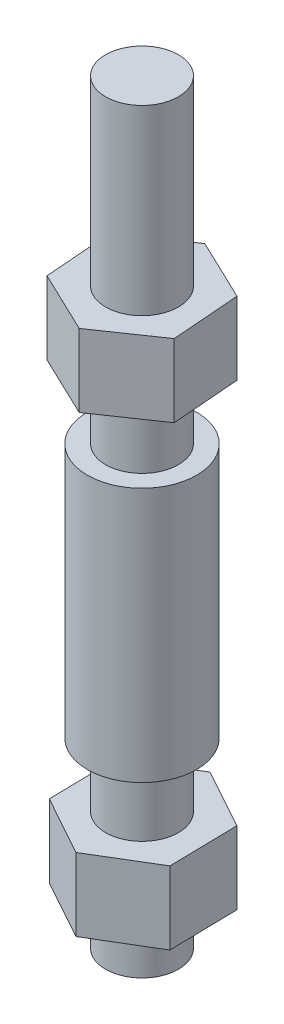
ISO-10303-21;
HEADER;
FILE_DESCRIPTION(('STEP AP214'),'2;1');
FILE_NAME('part.step','',(''),(''),'','','');
FILE_SCHEMA(('AUTOMOTIVE_DESIGN { 1 0 10303 214 1 1 1 1 }'));
ENDSEC;
DATA;
#1=APPLICATION_CONTEXT('core data for automotive mechanical design processes');
#2=APPLICATION_PROTOCOL_DEFINITION('international standard','automotive_design',2000,#1);
#3=PRODUCT_CONTEXT('',#1,'mechanical');
#4=PRODUCT('Part','Part','',(#3));
#5=PRODUCT_RELATED_PRODUCT_CATEGORY('part','',(#4));
#6=PRODUCT_DEFINITION_FORMATION('','',#4);
#7=PRODUCT_DEFINITION_CONTEXT('part definition',#1,'design');
#8=PRODUCT_DEFINITION('design','',#6,#7);
#9=PRODUCT_DEFINITION_SHAPE('','',#8);
#10=(LENGTH_UNIT() NAMED_UNIT(*) SI_UNIT(.MILLI.,.METRE.));
#11=(NAMED_UNIT(*) PLANE_ANGLE_UNIT() SI_UNIT($,.RADIAN.));
#12=(NAMED_UNIT(*) SI_UNIT($,.STERADIAN.) SOLID_ANGLE_UNIT());
#13=UNCERTAINTY_MEASURE_WITH_UNIT(LENGTH_MEASURE(1.E-05),#10,'distance_accuracy_value','');
#14=(GEOMETRIC_REPRESENTATION_CONTEXT(3) GLOBAL_UNCERTAINTY_ASSIGNED_CONTEXT((#13)) GLOBAL_UNIT_ASSIGNED_CONTEXT((#10,
#11,#12)) REPRESENTATION_CONTEXT('',''));
#15=CARTESIAN_POINT('',(0.,0.,0.));
#16=DIRECTION('',(0.,0.,1.));
#17=DIRECTION('',(1.,0.,0.));
#18=AXIS2_PLACEMENT_3D('',#15,#16,#17);
#19=CARTESIAN_POINT('',(0.,83.,0.));
#20=DIRECTION('',(0.,-1.,0.));
#21=DIRECTION('',(0.,0.,-1.));
#22=AXIS2_PLACEMENT_3D('',#19,#20,#21);
#23=CYLINDRICAL_SURFACE('',#22,4.);
#24=CARTESIAN_POINT('',(0.,48.,0.));
#25=DIRECTION('',(0.,1.,0.));
#26=DIRECTION('',(0.,0.,1.));
#27=AXIS2_PLACEMENT_3D('',#24,#25,#26);
#28=CIRCLE('',#27,4.);
#29=CARTESIAN_POINT('',(0.,48.,4.));
#30=VERTEX_POINT('',#29);
#31=EDGE_CURVE('E153',#30,#30,#28,.T.);
#32=ORIENTED_EDGE('',*,*,#31,.T.);
#33=EDGE_LOOP('',(#32));
#34=FACE_BOUND('',#33,.T.);
#35=CARTESIAN_POINT('',(0.,55.,0.));
#36=DIRECTION('',(0.,1.,0.));
#37=DIRECTION('',(0.,0.,1.));
#38=AXIS2_PLACEMENT_3D('',#35,#36,#37);
#39=CIRCLE('',#38,4.);
#40=CARTESIAN_POINT('',(0.,55.,4.));
#41=VERTEX_POINT('',#40);
#42=EDGE_CURVE('E11',#41,#41,#39,.T.);
#43=ORIENTED_EDGE('',*,*,#42,.F.);
#44=EDGE_LOOP('',(#43));
#45=FACE_BOUND('',#44,.T.);
#46=ADVANCED_FACE('F33',(#34,#45),#23,.T.);
#47=CARTESIAN_POINT('',(0.,20.,0.));
#48=DIRECTION('',(0.,-1.,0.));
#49=DIRECTION('',(0.,0.,-1.));
#50=AXIS2_PLACEMENT_3D('',#47,#48,#49);
#51=CYLINDRICAL_SURFACE('',#50,4.);
#52=CARTESIAN_POINT('',(0.,20.,0.));
#53=DIRECTION('',(0.,1.,0.));
#54=DIRECTION('',(0.,0.,1.));
#55=AXIS2_PLACEMENT_3D('',#52,#53,#54);
#56=CIRCLE('',#55,4.);
#57=CARTESIAN_POINT('',(0.,20.,4.));
#58=VERTEX_POINT('',#57);
#59=EDGE_CURVE('E156',#58,#58,#56,.T.);
#60=ORIENTED_EDGE('',*,*,#59,.F.);
#61=EDGE_LOOP('',(#60));
#62=FACE_BOUND('',#61,.T.);
#63=CARTESIAN_POINT('',(0.,13.,0.));
#64=DIRECTION('',(0.,-1.,0.));
#65=DIRECTION('',(0.,0.,-1.));
#66=AXIS2_PLACEMENT_3D('',#63,#64,#65);
#67=CIRCLE('',#66,4.);
#68=CARTESIAN_POINT('',(0.,13.,-4.));
#69=VERTEX_POINT('',#68);
#70=EDGE_CURVE('E42',#69,#69,#67,.T.);
#71=ORIENTED_EDGE('',*,*,#70,.F.);
#72=EDGE_LOOP('',(#71));
#73=FACE_BOUND('',#72,.T.);
#74=ADVANCED_FACE('F218',(#62,#73),#51,.T.);
#75=CARTESIAN_POINT('',(0.,48.,0.));
#76=DIRECTION('',(0.,-1.,0.));
#77=DIRECTION('',(0.,0.,-1.));
#78=AXIS2_PLACEMENT_3D('',#75,#76,#77);
#79=CYLINDRICAL_SURFACE('',#78,6.);
#80=CARTESIAN_POINT('',(0.,48.,0.));
#81=DIRECTION('',(0.,1.,0.));
#82=DIRECTION('',(0.,0.,1.));
#83=AXIS2_PLACEMENT_3D('',#80,#81,#82);
#84=CIRCLE('',#83,6.);
#85=CARTESIAN_POINT('',(0.,48.,6.));
#86=VERTEX_POINT('',#85);
#87=EDGE_CURVE('E157',#86,#86,#84,.T.);
#88=ORIENTED_EDGE('',*,*,#87,.F.);
#89=EDGE_LOOP('',(#88));
#90=FACE_BOUND('',#89,.T.);
#91=CARTESIAN_POINT('',(0.,20.,0.));
#92=DIRECTION('',(0.,1.,0.));
#93=DIRECTION('',(0.,0.,1.));
#94=AXIS2_PLACEMENT_3D('',#91,#92,#93);
#95=CIRCLE('',#94,6.);
#96=CARTESIAN_POINT('',(0.,20.,6.));
#97=VERTEX_POINT('',#96);
#98=EDGE_CURVE('E152',#97,#97,#95,.T.);
#99=ORIENTED_EDGE('',*,*,#98,.T.);
#100=EDGE_LOOP('',(#99));
#101=FACE_BOUND('',#100,.T.);
#102=ADVANCED_FACE('F225',(#90,#101),#79,.T.);
#103=CARTESIAN_POINT('',(0.,48.,0.));
#104=DIRECTION('',(0.,1.,0.));
#105=DIRECTION('',(0.,0.,1.));
#106=AXIS2_PLACEMENT_3D('',#103,#104,#105);
#107=PLANE('',#106);
#108=ORIENTED_EDGE('',*,*,#31,.F.);
#109=EDGE_LOOP('',(#108));
#110=FACE_BOUND('',#109,.T.);
#111=ORIENTED_EDGE('',*,*,#87,.T.);
#112=EDGE_LOOP('',(#111));
#113=FACE_BOUND('',#112,.T.);
#114=ADVANCED_FACE('F418',(#110,#113),#107,.T.);
#115=CARTESIAN_POINT('',(0.,20.,0.));
#116=DIRECTION('',(0.,1.,0.));
#117=DIRECTION('',(0.,0.,1.));
#118=AXIS2_PLACEMENT_3D('',#115,#116,#117);
#119=PLANE('',#118);
#120=ORIENTED_EDGE('',*,*,#59,.T.);
#121=EDGE_LOOP('',(#120));
#122=FACE_BOUND('',#121,.T.);
#123=ORIENTED_EDGE('',*,*,#98,.F.);
#124=EDGE_LOOP('',(#123));
#125=FACE_BOUND('',#124,.T.);
#126=ADVANCED_FACE('F214',(#122,#125),#119,.F.);
#127=CARTESIAN_POINT('',(0.260009596375043,13.,7.50427051243021));
#128=DIRECTION('',(-0.483902484389894,0.,0.875121926134461));
#129=DIRECTION('',(0.875121926134461,0.,0.483902484389894));
#130=AXIS2_PLACEMENT_3D('',#127,#128,#129);
#131=PLANE('',#130);
#132=DIRECTION('',(-0.875121926134461,0.,-0.483902484389894));
#133=VECTOR('',#132,1.);
#134=CARTESIAN_POINT('',(0.260009596375043,5.,7.50427051243021));
#135=LINE('',#134,#133);
#136=CARTESIAN_POINT('',(0.260009596375043,5.,7.50427051243021));
#137=VERTEX_POINT('',#136);
#138=CARTESIAN_POINT('',(-6.30826483878213,5.,3.87231452731777));
#139=VERTEX_POINT('',#138);
#140=EDGE_CURVE('E125',#137,#139,#135,.T.);
#141=ORIENTED_EDGE('',*,*,#140,.F.);
#142=DIRECTION('',(0.,-1.,0.));
#143=VECTOR('',#142,1.);
#144=CARTESIAN_POINT('',(0.260009596375043,13.,7.50427051243021));
#145=LINE('',#144,#143);
#146=CARTESIAN_POINT('',(0.260009596375043,13.,7.50427051243021));
#147=VERTEX_POINT('',#146);
#148=EDGE_CURVE('E50',#147,#137,#145,.T.);
#149=ORIENTED_EDGE('',*,*,#148,.F.);
#150=DIRECTION('',(-0.875121926134461,0.,-0.483902484389894));
#151=VECTOR('',#150,1.);
#152=CARTESIAN_POINT('',(0.260009596375043,13.,7.50427051243021));
#153=LINE('',#152,#151);
#154=CARTESIAN_POINT('',(-6.30826483878213,13.,3.87231452731777));
#155=VERTEX_POINT('',#154);
#156=EDGE_CURVE('E141',#147,#155,#153,.T.);
#157=ORIENTED_EDGE('',*,*,#156,.T.);
#158=DIRECTION('',(0.,-1.,0.));
#159=VECTOR('',#158,1.);
#160=CARTESIAN_POINT('',(-6.30826483878213,13.,3.87231452731777));
#161=LINE('',#160,#159);
#162=EDGE_CURVE('E86',#155,#139,#161,.T.);
#163=ORIENTED_EDGE('',*,*,#162,.T.);
#164=EDGE_LOOP('',(#141,#149,#157,#163));
#165=FACE_BOUND('',#164,.T.);
#166=ADVANCED_FACE('F203',(#165),#131,.T.);
#167=CARTESIAN_POINT('',(6.68951296248794,13.,3.63195598511244));
#168=DIRECTION('',(0.515926577246265,0.,0.856632807503281));
#169=DIRECTION('',(0.856632807503281,0.,-0.515926577246265));
#170=AXIS2_PLACEMENT_3D('',#167,#168,#169);
#171=PLANE('',#170);
#172=DIRECTION('',(-0.856632807503281,0.,0.515926577246265));
#173=VECTOR('',#172,1.);
#174=CARTESIAN_POINT('',(6.68951296248794,5.,3.63195598511244));
#175=LINE('',#174,#173);
#176=CARTESIAN_POINT('',(6.68951296248794,5.,3.63195598511244));
#177=VERTEX_POINT('',#176);
#178=EDGE_CURVE('E138',#177,#137,#175,.T.);
#179=ORIENTED_EDGE('',*,*,#178,.F.);
#180=DIRECTION('',(0.,-1.,0.));
#181=VECTOR('',#180,1.);
#182=CARTESIAN_POINT('',(6.68951296248794,13.,3.63195598511244));
#183=LINE('',#182,#181);
#184=CARTESIAN_POINT('',(6.68951296248794,13.,3.63195598511244));
#185=VERTEX_POINT('',#184);
#186=EDGE_CURVE('E74',#185,#177,#183,.T.);
#187=ORIENTED_EDGE('',*,*,#186,.F.);
#188=DIRECTION('',(-0.856632807503281,0.,0.515926577246265));
#189=VECTOR('',#188,1.);
#190=CARTESIAN_POINT('',(6.68951296248794,13.,3.63195598511244));
#191=LINE('',#190,#189);
#192=EDGE_CURVE('E115',#185,#147,#191,.T.);
#193=ORIENTED_EDGE('',*,*,#192,.T.);
#194=ORIENTED_EDGE('',*,*,#148,.T.);
#195=EDGE_LOOP('',(#179,#187,#193,#194));
#196=FACE_BOUND('',#195,.T.);
#197=ADVANCED_FACE('F206',(#196),#171,.T.);
#198=CARTESIAN_POINT('',(6.55074189344367,13.,-3.87231452731777));
#199=DIRECTION('',(0.999829061636159,0.,-0.0184891186311792));
#200=DIRECTION('',(-0.0184891186311792,0.,-0.999829061636159));
#201=AXIS2_PLACEMENT_3D('',#198,#199,#200);
#202=PLANE('',#201);
#203=DIRECTION('',(0.0184891186311792,0.,0.999829061636159));
#204=VECTOR('',#203,1.);
#205=CARTESIAN_POINT('',(6.55074189344367,5.,-3.87231452731777));
#206=LINE('',#205,#204);
#207=CARTESIAN_POINT('',(6.55074189344367,5.,-3.87231452731777));
#208=VERTEX_POINT('',#207);
#209=EDGE_CURVE('E102',#208,#177,#206,.T.);
#210=ORIENTED_EDGE('',*,*,#209,.F.);
#211=DIRECTION('',(0.,-1.,0.));
#212=VECTOR('',#211,1.);
#213=CARTESIAN_POINT('',(6.55074189344367,13.,-3.87231452731777));
#214=LINE('',#213,#212);
#215=CARTESIAN_POINT('',(6.55074189344367,13.,-3.87231452731777));
#216=VERTEX_POINT('',#215);
#217=EDGE_CURVE('E97',#216,#208,#214,.T.);
#218=ORIENTED_EDGE('',*,*,#217,.F.);
#219=DIRECTION('',(0.0184891186311792,0.,0.999829061636159));
#220=VECTOR('',#219,1.);
#221=CARTESIAN_POINT('',(6.55074189344367,13.,-3.87231452731777));
#222=LINE('',#221,#220);
#223=EDGE_CURVE('E100',#216,#185,#222,.T.);
#224=ORIENTED_EDGE('',*,*,#223,.T.);
#225=ORIENTED_EDGE('',*,*,#186,.T.);
#226=EDGE_LOOP('',(#210,#218,#224,#225));
#227=FACE_BOUND('',#226,.T.);
#228=ADVANCED_FACE('F99',(#227),#202,.T.);
#229=CARTESIAN_POINT('',(-0.0175325417135008,13.,-7.50427051243021));
#230=DIRECTION('',(0.483902484389894,0.,-0.87512192613446));
#231=DIRECTION('',(-0.875121926134461,0.,-0.483902484389894));
#232=AXIS2_PLACEMENT_3D('',#229,#230,#231);
#233=PLANE('',#232);
#234=DIRECTION('',(0.87512192613446,0.,0.483902484389894));
#235=VECTOR('',#234,1.);
#236=CARTESIAN_POINT('',(-0.0175325417135008,5.,-7.50427051243021));
#237=LINE('',#236,#235);
#238=CARTESIAN_POINT('',(-0.0175325417135008,5.,-7.50427051243021));
#239=VERTEX_POINT('',#238);
#240=EDGE_CURVE('E135',#239,#208,#237,.T.);
#241=ORIENTED_EDGE('',*,*,#240,.F.);
#242=DIRECTION('',(0.,-1.,0.));
#243=VECTOR('',#242,1.);
#244=CARTESIAN_POINT('',(-0.0175325417135008,13.,-7.50427051243021));
#245=LINE('',#244,#243);
#246=CARTESIAN_POINT('',(-0.0175325417135008,13.,-7.50427051243021));
#247=VERTEX_POINT('',#246);
#248=EDGE_CURVE('E107',#247,#239,#245,.T.);
#249=ORIENTED_EDGE('',*,*,#248,.F.);
#250=DIRECTION('',(0.87512192613446,0.,0.483902484389894));
#251=VECTOR('',#250,1.);
#252=CARTESIAN_POINT('',(-0.0175325417135008,13.,-7.50427051243021));
#253=LINE('',#252,#251);
#254=EDGE_CURVE('E113',#247,#216,#253,.T.);
#255=ORIENTED_EDGE('',*,*,#254,.T.);
#256=ORIENTED_EDGE('',*,*,#217,.T.);
#257=EDGE_LOOP('',(#241,#249,#255,#256));
#258=FACE_BOUND('',#257,.T.);
#259=ADVANCED_FACE('F117',(#258),#233,.T.);
#260=CARTESIAN_POINT('',(-6.4470359078264,13.,-3.63195598511244));
#261=DIRECTION('',(-0.515926577246265,0.,-0.856632807503281));
#262=DIRECTION('',(-0.856632807503281,0.,0.515926577246265));
#263=AXIS2_PLACEMENT_3D('',#260,#261,#262);
#264=PLANE('',#263);
#265=DIRECTION('',(0.856632807503281,0.,-0.515926577246265));
#266=VECTOR('',#265,1.);
#267=CARTESIAN_POINT('',(-6.4470359078264,5.,-3.63195598511244));
#268=LINE('',#267,#266);
#269=CARTESIAN_POINT('',(-6.4470359078264,5.,-3.63195598511244));
#270=VERTEX_POINT('',#269);
#271=EDGE_CURVE('E132',#270,#239,#268,.T.);
#272=ORIENTED_EDGE('',*,*,#271,.F.);
#273=DIRECTION('',(0.,-1.,0.));
#274=VECTOR('',#273,1.);
#275=CARTESIAN_POINT('',(-6.4470359078264,13.,-3.63195598511244));
#276=LINE('',#275,#274);
#277=CARTESIAN_POINT('',(-6.4470359078264,13.,-3.63195598511244));
#278=VERTEX_POINT('',#277);
#279=EDGE_CURVE('E146',#278,#270,#276,.T.);
#280=ORIENTED_EDGE('',*,*,#279,.F.);
#281=DIRECTION('',(0.856632807503281,0.,-0.515926577246265));
#282=VECTOR('',#281,1.);
#283=CARTESIAN_POINT('',(-6.4470359078264,13.,-3.63195598511244));
#284=LINE('',#283,#282);
#285=EDGE_CURVE('E118',#278,#247,#284,.T.);
#286=ORIENTED_EDGE('',*,*,#285,.T.);
#287=ORIENTED_EDGE('',*,*,#248,.T.);
#288=EDGE_LOOP('',(#272,#280,#286,#287));
#289=FACE_BOUND('',#288,.T.);
#290=ADVANCED_FACE('F248',(#289),#264,.T.);
#291=CARTESIAN_POINT('',(-6.30826483878213,13.,3.87231452731777));
#292=DIRECTION('',(-0.999829061636159,0.,0.0184891186311789));
#293=DIRECTION('',(0.0184891186311789,0.,0.999829061636159));
#294=AXIS2_PLACEMENT_3D('',#291,#292,#293);
#295=PLANE('',#294);
#296=DIRECTION('',(-0.0184891186311789,0.,-0.999829061636159));
#297=VECTOR('',#296,1.);
#298=CARTESIAN_POINT('',(-6.30826483878213,5.,3.87231452731777));
#299=LINE('',#298,#297);
#300=EDGE_CURVE('E128',#139,#270,#299,.T.);
#301=ORIENTED_EDGE('',*,*,#300,.F.);
#302=ORIENTED_EDGE('',*,*,#162,.F.);
#303=DIRECTION('',(-0.0184891186311789,0.,-0.999829061636159));
#304=VECTOR('',#303,1.);
#305=CARTESIAN_POINT('',(-6.30826483878213,13.,3.87231452731777));
#306=LINE('',#305,#304);
#307=EDGE_CURVE('E120',#155,#278,#306,.T.);
#308=ORIENTED_EDGE('',*,*,#307,.T.);
#309=ORIENTED_EDGE('',*,*,#279,.T.);
#310=EDGE_LOOP('',(#301,#302,#308,#309));
#311=FACE_BOUND('',#310,.T.);
#312=ADVANCED_FACE('F201',(#311),#295,.T.);
#313=CARTESIAN_POINT('',(0.,13.,0.));
#314=DIRECTION('',(0.,-1.,0.));
#315=DIRECTION('',(0.,0.,-1.));
#316=AXIS2_PLACEMENT_3D('',#313,#314,#315);
#317=PLANE('',#316);
#318=ORIENTED_EDGE('',*,*,#70,.T.);
#319=EDGE_LOOP('',(#318));
#320=FACE_BOUND('',#319,.T.);
#321=ORIENTED_EDGE('',*,*,#156,.F.);
#322=ORIENTED_EDGE('',*,*,#192,.F.);
#323=ORIENTED_EDGE('',*,*,#223,.F.);
#324=ORIENTED_EDGE('',*,*,#254,.F.);
#325=ORIENTED_EDGE('',*,*,#285,.F.);
#326=ORIENTED_EDGE('',*,*,#307,.F.);
#327=EDGE_LOOP('',(#321,#322,#323,#324,#325,#326));
#328=FACE_BOUND('',#327,.T.);
#329=ADVANCED_FACE('F111',(#320,#328),#317,.F.);
#330=CARTESIAN_POINT('',(0.,5.,0.));
#331=DIRECTION('',(0.,-1.,0.));
#332=DIRECTION('',(0.,0.,-1.));
#333=AXIS2_PLACEMENT_3D('',#330,#331,#332);
#334=PLANE('',#333);
#335=CARTESIAN_POINT('',(0.,5.,0.));
#336=DIRECTION('',(0.,-1.,0.));
#337=DIRECTION('',(0.,0.,-1.));
#338=AXIS2_PLACEMENT_3D('',#335,#336,#337);
#339=CIRCLE('',#338,4.);
#340=CARTESIAN_POINT('',(0.,5.,-4.));
#341=VERTEX_POINT('',#340);
#342=EDGE_CURVE('E143',#341,#341,#339,.T.);
#343=ORIENTED_EDGE('',*,*,#342,.F.);
#344=EDGE_LOOP('',(#343));
#345=FACE_BOUND('',#344,.T.);
#346=ORIENTED_EDGE('',*,*,#140,.T.);
#347=ORIENTED_EDGE('',*,*,#300,.T.);
#348=ORIENTED_EDGE('',*,*,#271,.T.);
#349=ORIENTED_EDGE('',*,*,#240,.T.);
#350=ORIENTED_EDGE('',*,*,#209,.T.);
#351=ORIENTED_EDGE('',*,*,#178,.T.);
#352=EDGE_LOOP('',(#346,#347,#348,#349,#350,#351));
#353=FACE_BOUND('',#352,.T.);
#354=ADVANCED_FACE('F205',(#345,#353),#334,.T.);
#355=CARTESIAN_POINT('',(0.,0.,0.));
#356=DIRECTION('',(0.,1.,0.));
#357=DIRECTION('',(0.,0.,1.));
#358=AXIS2_PLACEMENT_3D('',#355,#356,#357);
#359=PLANE('',#358);
#360=CARTESIAN_POINT('',(0.,0.,0.));
#361=DIRECTION('',(0.,1.,0.));
#362=DIRECTION('',(0.,0.,1.));
#363=AXIS2_PLACEMENT_3D('',#360,#361,#362);
#364=CIRCLE('',#363,4.);
#365=CARTESIAN_POINT('',(0.,0.,4.));
#366=VERTEX_POINT('',#365);
#367=EDGE_CURVE('E160',#366,#366,#364,.T.);
#368=ORIENTED_EDGE('',*,*,#367,.F.);
#369=EDGE_LOOP('',(#368));
#370=FACE_BOUND('',#369,.T.);
#371=ADVANCED_FACE('F278',(#370),#359,.F.);
#372=ORIENTED_EDGE('',*,*,#342,.T.);
#373=EDGE_LOOP('',(#372));
#374=FACE_BOUND('',#373,.T.);
#375=ORIENTED_EDGE('',*,*,#367,.T.);
#376=EDGE_LOOP('',(#375));
#377=FACE_BOUND('',#376,.T.);
#378=ADVANCED_FACE('F35',(#374,#377),#51,.T.);
#379=CARTESIAN_POINT('',(0.586534649413178,55.,7.48260051308174));
#380=DIRECTION('',(0.566148008063003,0.,0.824303604848538));
#381=DIRECTION('',(0.824303604848538,0.,-0.566148008063003));
#382=AXIS2_PLACEMENT_3D('',#379,#380,#381);
#383=PLANE('',#382);
#384=DIRECTION('',(0.824303604848538,0.,-0.566148008063003));
#385=VECTOR('',#384,1.);
#386=CARTESIAN_POINT('',(0.586534649413178,63.,7.48260051308174));
#387=LINE('',#386,#385);
#388=CARTESIAN_POINT('',(0.586534649413178,63.,7.48260051308174));
#389=VERTEX_POINT('',#388);
#390=CARTESIAN_POINT('',(6.77338945540585,63.,3.23334634994926));
#391=VERTEX_POINT('',#390);
#392=EDGE_CURVE('E472',#389,#391,#387,.T.);
#393=ORIENTED_EDGE('',*,*,#392,.F.);
#394=DIRECTION('',(0.,1.,0.));
#395=VECTOR('',#394,1.);
#396=CARTESIAN_POINT('',(0.586534649413178,55.,7.48260051308174));
#397=LINE('',#396,#395);
#398=CARTESIAN_POINT('',(0.586534649413178,55.,7.48260051308174));
#399=VERTEX_POINT('',#398);
#400=EDGE_CURVE('E171',#399,#389,#397,.T.);
#401=ORIENTED_EDGE('',*,*,#400,.F.);
#402=DIRECTION('',(0.824303604848538,0.,-0.566148008063003));
#403=VECTOR('',#402,1.);
#404=CARTESIAN_POINT('',(0.586534649413178,55.,7.48260051308174));
#405=LINE('',#404,#403);
#406=CARTESIAN_POINT('',(6.77338945540585,55.,3.23334634994926));
#407=VERTEX_POINT('',#406);
#408=EDGE_CURVE('E455',#399,#407,#405,.T.);
#409=ORIENTED_EDGE('',*,*,#408,.T.);
#410=DIRECTION('',(0.,1.,0.));
#411=VECTOR('',#410,1.);
#412=CARTESIAN_POINT('',(6.77338945540585,55.,3.23334634994926));
#413=LINE('',#412,#411);
#414=EDGE_CURVE('E197',#407,#391,#413,.T.);
#415=ORIENTED_EDGE('',*,*,#414,.T.);
#416=EDGE_LOOP('',(#393,#401,#409,#415));
#417=FACE_BOUND('',#416,.T.);
#418=ADVANCED_FACE('F292',(#417),#383,.T.);
#419=CARTESIAN_POINT('',(-6.18685480599267,55.,4.24925416313248));
#420=DIRECTION('',(-0.430793858198422,0.,0.902450359708786));
#421=DIRECTION('',(0.902450359708786,0.,0.430793858198422));
#422=AXIS2_PLACEMENT_3D('',#419,#420,#421);
#423=PLANE('',#422);
#424=DIRECTION('',(0.902450359708786,0.,0.430793858198422));
#425=VECTOR('',#424,1.);
#426=CARTESIAN_POINT('',(-6.18685480599267,63.,4.24925416313248));
#427=LINE('',#426,#425);
#428=CARTESIAN_POINT('',(-6.18685480599267,63.,4.24925416313248));
#429=VERTEX_POINT('',#428);
#430=EDGE_CURVE('E186',#429,#389,#427,.T.);
#431=ORIENTED_EDGE('',*,*,#430,.F.);
#432=DIRECTION('',(0.,1.,0.));
#433=VECTOR('',#432,1.);
#434=CARTESIAN_POINT('',(-6.18685480599267,55.,4.24925416313248));
#435=LINE('',#434,#433);
#436=CARTESIAN_POINT('',(-6.18685480599267,55.,4.24925416313248));
#437=VERTEX_POINT('',#436);
#438=EDGE_CURVE('E175',#437,#429,#435,.T.);
#439=ORIENTED_EDGE('',*,*,#438,.F.);
#440=DIRECTION('',(0.902450359708786,0.,0.430793858198422));
#441=VECTOR('',#440,1.);
#442=CARTESIAN_POINT('',(-6.18685480599267,55.,4.24925416313248));
#443=LINE('',#442,#441);
#444=EDGE_CURVE('E200',#437,#399,#443,.T.);
#445=ORIENTED_EDGE('',*,*,#444,.T.);
#446=ORIENTED_EDGE('',*,*,#400,.T.);
#447=EDGE_LOOP('',(#431,#439,#445,#446));
#448=FACE_BOUND('',#447,.T.);
#449=ADVANCED_FACE('F299',(#448),#423,.T.);
#450=CARTESIAN_POINT('',(-6.77338945540585,55.,-3.23334634994926));
#451=DIRECTION('',(-0.996941866261425,0.,0.0781467548602481));
#452=DIRECTION('',(0.0781467548602481,0.,0.996941866261425));
#453=AXIS2_PLACEMENT_3D('',#450,#451,#452);
#454=PLANE('',#453);
#455=DIRECTION('',(0.0781467548602481,0.,0.996941866261425));
#456=VECTOR('',#455,1.);
#457=CARTESIAN_POINT('',(-6.77338945540585,63.,-3.23334634994926));
#458=LINE('',#457,#456);
#459=CARTESIAN_POINT('',(-6.77338945540585,63.,-3.23334634994926));
#460=VERTEX_POINT('',#459);
#461=EDGE_CURVE('E483',#460,#429,#458,.T.);
#462=ORIENTED_EDGE('',*,*,#461,.F.);
#463=DIRECTION('',(0.,1.,0.));
#464=VECTOR('',#463,1.);
#465=CARTESIAN_POINT('',(-6.77338945540585,55.,-3.23334634994926));
#466=LINE('',#465,#464);
#467=CARTESIAN_POINT('',(-6.77338945540585,55.,-3.23334634994926));
#468=VERTEX_POINT('',#467);
#469=EDGE_CURVE('E183',#468,#460,#466,.T.);
#470=ORIENTED_EDGE('',*,*,#469,.F.);
#471=DIRECTION('',(0.0781467548602481,0.,0.996941866261425));
#472=VECTOR('',#471,1.);
#473=CARTESIAN_POINT('',(-6.77338945540585,55.,-3.23334634994926));
#474=LINE('',#473,#472);
#475=EDGE_CURVE('E466',#468,#437,#474,.T.);
#476=ORIENTED_EDGE('',*,*,#475,.T.);
#477=ORIENTED_EDGE('',*,*,#438,.T.);
#478=EDGE_LOOP('',(#462,#470,#476,#477));
#479=FACE_BOUND('',#478,.T.);
#480=ADVANCED_FACE('F307',(#479),#454,.T.);
#481=CARTESIAN_POINT('',(-0.586534649413179,55.,-7.48260051308174));
#482=DIRECTION('',(-0.566148008063002,0.,-0.824303604848538));
#483=DIRECTION('',(-0.824303604848538,0.,0.566148008063002));
#484=AXIS2_PLACEMENT_3D('',#481,#482,#483);
#485=PLANE('',#484);
#486=DIRECTION('',(-0.824303604848538,0.,0.566148008063002));
#487=VECTOR('',#486,1.);
#488=CARTESIAN_POINT('',(-0.586534649413179,63.,-7.48260051308174));
#489=LINE('',#488,#487);
#490=CARTESIAN_POINT('',(-0.586534649413179,63.,-7.48260051308174));
#491=VERTEX_POINT('',#490);
#492=EDGE_CURVE('E481',#491,#460,#489,.T.);
#493=ORIENTED_EDGE('',*,*,#492,.F.);
#494=DIRECTION('',(0.,1.,0.));
#495=VECTOR('',#494,1.);
#496=CARTESIAN_POINT('',(-0.586534649413179,55.,-7.48260051308174));
#497=LINE('',#496,#495);
#498=CARTESIAN_POINT('',(-0.586534649413179,55.,-7.48260051308174));
#499=VERTEX_POINT('',#498);
#500=EDGE_CURVE('E191',#499,#491,#497,.T.);
#501=ORIENTED_EDGE('',*,*,#500,.F.);
#502=DIRECTION('',(-0.824303604848538,0.,0.566148008063002));
#503=VECTOR('',#502,1.);
#504=CARTESIAN_POINT('',(-0.586534649413179,55.,-7.48260051308174));
#505=LINE('',#504,#503);
#506=EDGE_CURVE('E468',#499,#468,#505,.T.);
#507=ORIENTED_EDGE('',*,*,#506,.T.);
#508=ORIENTED_EDGE('',*,*,#469,.T.);
#509=EDGE_LOOP('',(#493,#501,#507,#508));
#510=FACE_BOUND('',#509,.T.);
#511=ADVANCED_FACE('F314',(#510),#485,.T.);
#512=CARTESIAN_POINT('',(6.18685480599267,55.,-4.24925416313249));
#513=DIRECTION('',(0.430793858198422,0.,-0.902450359708786));
#514=DIRECTION('',(-0.902450359708786,0.,-0.430793858198422));
#515=AXIS2_PLACEMENT_3D('',#512,#513,#514);
#516=PLANE('',#515);
#517=DIRECTION('',(-0.902450359708786,0.,-0.430793858198422));
#518=VECTOR('',#517,1.);
#519=CARTESIAN_POINT('',(6.18685480599267,63.,-4.24925416313249));
#520=LINE('',#519,#518);
#521=CARTESIAN_POINT('',(6.18685480599267,63.,-4.24925416313249));
#522=VERTEX_POINT('',#521);
#523=EDGE_CURVE('E478',#522,#491,#520,.T.);
#524=ORIENTED_EDGE('',*,*,#523,.F.);
#525=DIRECTION('',(0.,1.,0.));
#526=VECTOR('',#525,1.);
#527=CARTESIAN_POINT('',(6.18685480599267,55.,-4.24925416313249));
#528=LINE('',#527,#526);
#529=CARTESIAN_POINT('',(6.18685480599267,55.,-4.24925416313249));
#530=VERTEX_POINT('',#529);
#531=EDGE_CURVE('E194',#530,#522,#528,.T.);
#532=ORIENTED_EDGE('',*,*,#531,.F.);
#533=DIRECTION('',(-0.902450359708786,0.,-0.430793858198422));
#534=VECTOR('',#533,1.);
#535=CARTESIAN_POINT('',(6.18685480599267,55.,-4.24925416313249));
#536=LINE('',#535,#534);
#537=EDGE_CURVE('E513',#530,#499,#536,.T.);
#538=ORIENTED_EDGE('',*,*,#537,.T.);
#539=ORIENTED_EDGE('',*,*,#500,.T.);
#540=EDGE_LOOP('',(#524,#532,#538,#539));
#541=FACE_BOUND('',#540,.T.);
#542=ADVANCED_FACE('F322',(#541),#516,.T.);
#543=CARTESIAN_POINT('',(6.77338945540585,55.,3.23334634994926));
#544=DIRECTION('',(0.996941866261425,0.,-0.0781467548602484));
#545=DIRECTION('',(-0.0781467548602484,0.,-0.996941866261425));
#546=AXIS2_PLACEMENT_3D('',#543,#544,#545);
#547=PLANE('',#546);
#548=DIRECTION('',(-0.0781467548602484,0.,-0.996941866261425));
#549=VECTOR('',#548,1.);
#550=CARTESIAN_POINT('',(6.77338945540585,63.,3.23334634994926));
#551=LINE('',#550,#549);
#552=EDGE_CURVE('E475',#391,#522,#551,.T.);
#553=ORIENTED_EDGE('',*,*,#552,.F.);
#554=ORIENTED_EDGE('',*,*,#414,.F.);
#555=DIRECTION('',(-0.0781467548602484,0.,-0.996941866261425));
#556=VECTOR('',#555,1.);
#557=CARTESIAN_POINT('',(6.77338945540585,55.,3.23334634994926));
#558=LINE('',#557,#556);
#559=EDGE_CURVE('E461',#407,#530,#558,.T.);
#560=ORIENTED_EDGE('',*,*,#559,.T.);
#561=ORIENTED_EDGE('',*,*,#531,.T.);
#562=EDGE_LOOP('',(#553,#554,#560,#561));
#563=FACE_BOUND('',#562,.T.);
#564=ADVANCED_FACE('F330',(#563),#547,.T.);
#565=CARTESIAN_POINT('',(0.,55.,0.));
#566=DIRECTION('',(0.,1.,0.));
#567=DIRECTION('',(0.,0.,1.));
#568=AXIS2_PLACEMENT_3D('',#565,#566,#567);
#569=PLANE('',#568);
#570=ORIENTED_EDGE('',*,*,#42,.T.);
#571=EDGE_LOOP('',(#570));
#572=FACE_BOUND('',#571,.T.);
#573=ORIENTED_EDGE('',*,*,#408,.F.);
#574=ORIENTED_EDGE('',*,*,#444,.F.);
#575=ORIENTED_EDGE('',*,*,#475,.F.);
#576=ORIENTED_EDGE('',*,*,#506,.F.);
#577=ORIENTED_EDGE('',*,*,#537,.F.);
#578=ORIENTED_EDGE('',*,*,#559,.F.);
#579=EDGE_LOOP('',(#573,#574,#575,#576,#577,#578));
#580=FACE_BOUND('',#579,.T.);
#581=ADVANCED_FACE('F242',(#572,#580),#569,.F.);
#582=CARTESIAN_POINT('',(0.,63.,0.));
#583=DIRECTION('',(0.,1.,0.));
#584=DIRECTION('',(0.,0.,1.));
#585=AXIS2_PLACEMENT_3D('',#582,#583,#584);
#586=PLANE('',#585);
#587=CARTESIAN_POINT('',(0.,63.,0.));
#588=DIRECTION('',(0.,1.,0.));
#589=DIRECTION('',(0.,0.,1.));
#590=AXIS2_PLACEMENT_3D('',#587,#588,#589);
#591=CIRCLE('',#590,4.);
#592=CARTESIAN_POINT('',(0.,63.,4.));
#593=VERTEX_POINT('',#592);
#594=EDGE_CURVE('E129',#593,#593,#591,.T.);
#595=ORIENTED_EDGE('',*,*,#594,.F.);
#596=EDGE_LOOP('',(#595));
#597=FACE_BOUND('',#596,.T.);
#598=ORIENTED_EDGE('',*,*,#392,.T.);
#599=ORIENTED_EDGE('',*,*,#552,.T.);
#600=ORIENTED_EDGE('',*,*,#523,.T.);
#601=ORIENTED_EDGE('',*,*,#492,.T.);
#602=ORIENTED_EDGE('',*,*,#461,.T.);
#603=ORIENTED_EDGE('',*,*,#430,.T.);
#604=EDGE_LOOP('',(#598,#599,#600,#601,#602,#603));
#605=FACE_BOUND('',#604,.T.);
#606=ADVANCED_FACE('F235',(#597,#605),#586,.T.);
#607=CARTESIAN_POINT('',(0.,83.,0.));
#608=DIRECTION('',(0.,1.,0.));
#609=DIRECTION('',(0.,0.,1.));
#610=AXIS2_PLACEMENT_3D('',#607,#608,#609);
#611=PLANE('',#610);
#612=CARTESIAN_POINT('',(0.,83.,0.));
#613=DIRECTION('',(0.,1.,0.));
#614=DIRECTION('',(0.,0.,1.));
#615=AXIS2_PLACEMENT_3D('',#612,#613,#614);
#616=CIRCLE('',#615,4.);
#617=CARTESIAN_POINT('',(0.,83.,4.));
#618=VERTEX_POINT('',#617);
#619=EDGE_CURVE('E149',#618,#618,#616,.T.);
#620=ORIENTED_EDGE('',*,*,#619,.T.);
#621=EDGE_LOOP('',(#620));
#622=FACE_BOUND('',#621,.T.);
#623=ADVANCED_FACE('F231',(#622),#611,.T.);
#624=ORIENTED_EDGE('',*,*,#594,.T.);
#625=EDGE_LOOP('',(#624));
#626=FACE_BOUND('',#625,.T.);
#627=ORIENTED_EDGE('',*,*,#619,.F.);
#628=EDGE_LOOP('',(#627));
#629=FACE_BOUND('',#628,.T.);
#630=ADVANCED_FACE('F221',(#626,#629),#23,.T.);
#631=CLOSED_SHELL('',(#46,#74,#102,#114,#126,#166,#197,#228,#259,#290,#312,#329,#354,#371,#378,
#418,#449,#480,#511,#542,#564,#581,#606,#623,#630));
#632=MANIFOLD_SOLID_BREP('B2',#631);
#633=ADVANCED_BREP_SHAPE_REPRESENTATION('',(#18,#632),#14);
#634=SHAPE_DEFINITION_REPRESENTATION(#9,#633);
ENDSEC;
END-ISO-10303-21;
